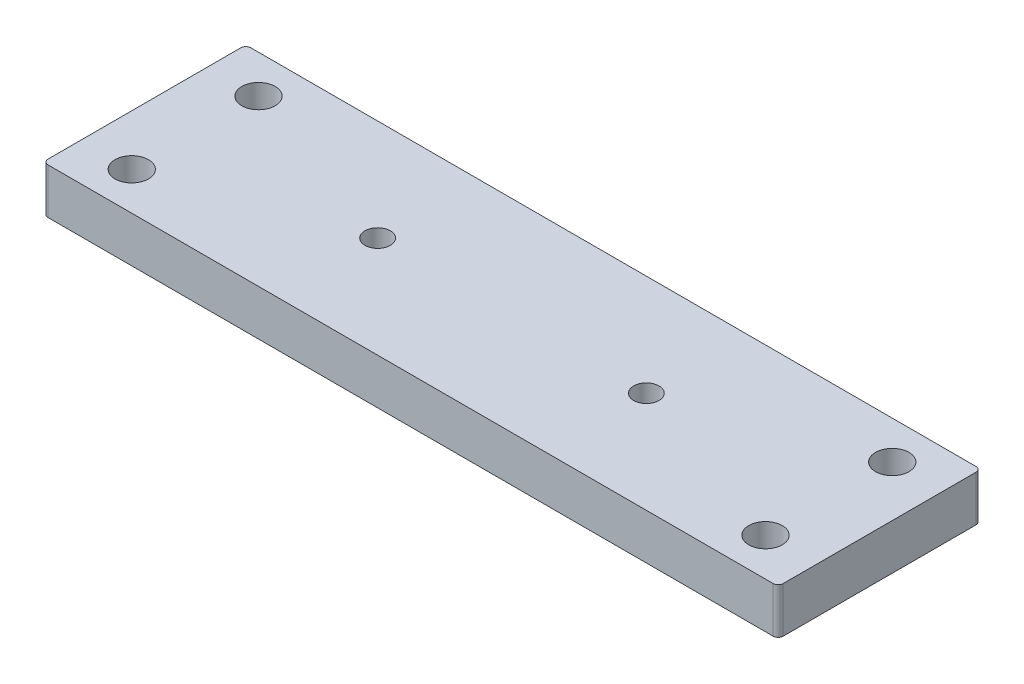
ISO-10303-21;
HEADER;
FILE_DESCRIPTION(('STEP AP214'),'2;1');
FILE_NAME('part.step','',(''),(''),'','','');
FILE_SCHEMA(('AUTOMOTIVE_DESIGN { 1 0 10303 214 1 1 1 1 }'));
ENDSEC;
DATA;
#1=APPLICATION_CONTEXT('core data for automotive mechanical design processes');
#2=APPLICATION_PROTOCOL_DEFINITION('international standard','automotive_design',2000,#1);
#3=PRODUCT_CONTEXT('',#1,'mechanical');
#4=PRODUCT('Part','Part','',(#3));
#5=PRODUCT_RELATED_PRODUCT_CATEGORY('part','',(#4));
#6=PRODUCT_DEFINITION_FORMATION('','',#4);
#7=PRODUCT_DEFINITION_CONTEXT('part definition',#1,'design');
#8=PRODUCT_DEFINITION('design','',#6,#7);
#9=PRODUCT_DEFINITION_SHAPE('','',#8);
#10=(LENGTH_UNIT() NAMED_UNIT(*) SI_UNIT(.MILLI.,.METRE.));
#11=(NAMED_UNIT(*) PLANE_ANGLE_UNIT() SI_UNIT($,.RADIAN.));
#12=(NAMED_UNIT(*) SI_UNIT($,.STERADIAN.) SOLID_ANGLE_UNIT());
#13=UNCERTAINTY_MEASURE_WITH_UNIT(LENGTH_MEASURE(1.E-05),#10,'distance_accuracy_value','');
#14=(GEOMETRIC_REPRESENTATION_CONTEXT(3) GLOBAL_UNCERTAINTY_ASSIGNED_CONTEXT((#13)) GLOBAL_UNIT_ASSIGNED_CONTEXT((#10,
#11,#12)) REPRESENTATION_CONTEXT('',''));
#15=CARTESIAN_POINT('',(0.,0.,0.));
#16=DIRECTION('',(0.,0.,1.));
#17=DIRECTION('',(1.,0.,0.));
#18=AXIS2_PLACEMENT_3D('',#15,#16,#17);
#19=CARTESIAN_POINT('',(0.,9.,0.));
#20=DIRECTION('',(0.,-1.,0.));
#21=DIRECTION('',(0.,0.,-1.));
#22=AXIS2_PLACEMENT_3D('',#19,#20,#21);
#23=PLANE('',#22);
#24=DIRECTION('',(0.,0.,-1.));
#25=VECTOR('',#24,1.);
#26=CARTESIAN_POINT('',(72.5,9.,20.));
#27=LINE('',#26,#25);
#28=CARTESIAN_POINT('',(72.5,9.,19.));
#29=VERTEX_POINT('',#28);
#30=CARTESIAN_POINT('',(72.5,9.,-19.));
#31=VERTEX_POINT('',#30);
#32=EDGE_CURVE('E151',#29,#31,#27,.T.);
#33=ORIENTED_EDGE('',*,*,#32,.T.);
#34=CARTESIAN_POINT('',(71.5,9.,-19.));
#35=DIRECTION('',(0.,-1.,0.));
#36=DIRECTION('',(0.,0.,-1.));
#37=AXIS2_PLACEMENT_3D('',#34,#35,#36);
#38=CIRCLE('',#37,1.);
#39=CARTESIAN_POINT('',(71.5,9.,-20.));
#40=VERTEX_POINT('',#39);
#41=EDGE_CURVE('E174',#31,#40,#38,.F.);
#42=ORIENTED_EDGE('',*,*,#41,.T.);
#43=DIRECTION('',(-1.,0.,0.));
#44=VECTOR('',#43,1.);
#45=CARTESIAN_POINT('',(-72.5,9.,-20.));
#46=LINE('',#45,#44);
#47=CARTESIAN_POINT('',(-71.5,9.,-20.));
#48=VERTEX_POINT('',#47);
#49=EDGE_CURVE('E127',#40,#48,#46,.T.);
#50=ORIENTED_EDGE('',*,*,#49,.T.);
#51=CARTESIAN_POINT('',(-71.5,9.,-19.));
#52=DIRECTION('',(0.,-1.,0.));
#53=DIRECTION('',(0.,0.,-1.));
#54=AXIS2_PLACEMENT_3D('',#51,#52,#53);
#55=CIRCLE('',#54,1.);
#56=CARTESIAN_POINT('',(-72.5,9.,-19.));
#57=VERTEX_POINT('',#56);
#58=EDGE_CURVE('E168',#48,#57,#55,.F.);
#59=ORIENTED_EDGE('',*,*,#58,.T.);
#60=DIRECTION('',(0.,0.,1.));
#61=VECTOR('',#60,1.);
#62=CARTESIAN_POINT('',(-72.5,9.,20.));
#63=LINE('',#62,#61);
#64=CARTESIAN_POINT('',(-72.5,9.,19.));
#65=VERTEX_POINT('',#64);
#66=EDGE_CURVE('E187',#57,#65,#63,.T.);
#67=ORIENTED_EDGE('',*,*,#66,.T.);
#68=CARTESIAN_POINT('',(-71.5,9.,19.));
#69=DIRECTION('',(0.,-1.,0.));
#70=DIRECTION('',(0.,0.,-1.));
#71=AXIS2_PLACEMENT_3D('',#68,#69,#70);
#72=CIRCLE('',#71,1.);
#73=CARTESIAN_POINT('',(-71.5,9.,20.));
#74=VERTEX_POINT('',#73);
#75=EDGE_CURVE('E61',#65,#74,#72,.F.);
#76=ORIENTED_EDGE('',*,*,#75,.T.);
#77=DIRECTION('',(1.,0.,0.));
#78=VECTOR('',#77,1.);
#79=CARTESIAN_POINT('',(-72.5,9.,20.));
#80=LINE('',#79,#78);
#81=CARTESIAN_POINT('',(71.5,9.,20.));
#82=VERTEX_POINT('',#81);
#83=EDGE_CURVE('E153',#74,#82,#80,.T.);
#84=ORIENTED_EDGE('',*,*,#83,.T.);
#85=CARTESIAN_POINT('',(71.5,9.,19.));
#86=DIRECTION('',(0.,-1.,0.));
#87=DIRECTION('',(0.,0.,-1.));
#88=AXIS2_PLACEMENT_3D('',#85,#86,#87);
#89=CIRCLE('',#88,1.);
#90=EDGE_CURVE('E171',#82,#29,#89,.F.);
#91=ORIENTED_EDGE('',*,*,#90,.T.);
#92=EDGE_LOOP('',(#33,#42,#50,#59,#67,#76,#84,#91));
#93=FACE_BOUND('',#92,.T.);
#94=CARTESIAN_POINT('',(26.5,9.,0.));
#95=DIRECTION('',(0.,1.,0.));
#96=DIRECTION('',(0.,0.,1.));
#97=AXIS2_PLACEMENT_3D('',#94,#95,#96);
#98=CIRCLE('',#97,2.5);
#99=CARTESIAN_POINT('',(26.5,9.,2.5));
#100=VERTEX_POINT('',#99);
#101=EDGE_CURVE('E145',#100,#100,#98,.T.);
#102=ORIENTED_EDGE('',*,*,#101,.F.);
#103=EDGE_LOOP('',(#102));
#104=FACE_BOUND('',#103,.T.);
#105=CARTESIAN_POINT('',(62.5,9.,12.5));
#106=DIRECTION('',(0.,1.,0.));
#107=DIRECTION('',(0.,0.,1.));
#108=AXIS2_PLACEMENT_3D('',#105,#106,#107);
#109=CIRCLE('',#108,3.30000000000001);
#110=CARTESIAN_POINT('',(62.5,9.,15.8));
#111=VERTEX_POINT('',#110);
#112=EDGE_CURVE('E215',#111,#111,#109,.T.);
#113=ORIENTED_EDGE('',*,*,#112,.F.);
#114=EDGE_LOOP('',(#113));
#115=FACE_BOUND('',#114,.T.);
#116=CARTESIAN_POINT('',(62.5,9.,-12.5));
#117=DIRECTION('',(0.,1.,0.));
#118=DIRECTION('',(0.,0.,-1.));
#119=AXIS2_PLACEMENT_3D('',#116,#117,#118);
#120=CIRCLE('',#119,3.30000000000001);
#121=CARTESIAN_POINT('',(62.5,9.,-15.8));
#122=VERTEX_POINT('',#121);
#123=EDGE_CURVE('E223',#122,#122,#120,.T.);
#124=ORIENTED_EDGE('',*,*,#123,.F.);
#125=EDGE_LOOP('',(#124));
#126=FACE_BOUND('',#125,.T.);
#127=CARTESIAN_POINT('',(-62.5,9.,12.500000000006));
#128=DIRECTION('',(0.,1.,0.));
#129=DIRECTION('',(0.,0.,1.));
#130=AXIS2_PLACEMENT_3D('',#127,#128,#129);
#131=CIRCLE('',#130,3.3);
#132=CARTESIAN_POINT('',(-62.5,9.,15.800000000006));
#133=VERTEX_POINT('',#132);
#134=EDGE_CURVE('E231',#133,#133,#131,.T.);
#135=ORIENTED_EDGE('',*,*,#134,.F.);
#136=EDGE_LOOP('',(#135));
#137=FACE_BOUND('',#136,.T.);
#138=CARTESIAN_POINT('',(-62.5,9.,-12.499999999994));
#139=DIRECTION('',(0.,1.,0.));
#140=DIRECTION('',(0.,0.,-1.));
#141=AXIS2_PLACEMENT_3D('',#138,#139,#140);
#142=CIRCLE('',#141,3.3);
#143=CARTESIAN_POINT('',(-62.5,9.,-15.799999999994));
#144=VERTEX_POINT('',#143);
#145=EDGE_CURVE('E239',#144,#144,#142,.T.);
#146=ORIENTED_EDGE('',*,*,#145,.F.);
#147=EDGE_LOOP('',(#146));
#148=FACE_BOUND('',#147,.T.);
#149=CARTESIAN_POINT('',(-26.5,9.,0.));
#150=DIRECTION('',(0.,1.,0.));
#151=DIRECTION('',(0.,0.,-1.));
#152=AXIS2_PLACEMENT_3D('',#149,#150,#151);
#153=CIRCLE('',#152,2.5);
#154=CARTESIAN_POINT('',(-26.5,9.,-2.49999999999999));
#155=VERTEX_POINT('',#154);
#156=EDGE_CURVE('E247',#155,#155,#153,.T.);
#157=ORIENTED_EDGE('',*,*,#156,.F.);
#158=EDGE_LOOP('',(#157));
#159=FACE_BOUND('',#158,.T.);
#160=ADVANCED_FACE('F38',(#93,#104,#115,#126,#137,#148,#159),#23,.F.);
#161=CARTESIAN_POINT('',(0.,0.,0.));
#162=DIRECTION('',(0.,-1.,0.));
#163=DIRECTION('',(0.,0.,-1.));
#164=AXIS2_PLACEMENT_3D('',#161,#162,#163);
#165=PLANE('',#164);
#166=CARTESIAN_POINT('',(-62.5,0.,-12.499999999994));
#167=DIRECTION('',(0.,1.,0.));
#168=DIRECTION('',(0.,0.,-1.));
#169=AXIS2_PLACEMENT_3D('',#166,#167,#168);
#170=CIRCLE('',#169,3.3);
#171=CARTESIAN_POINT('',(-62.5,0.,-15.799999999994));
#172=VERTEX_POINT('',#171);
#173=EDGE_CURVE('E243',#172,#172,#170,.T.);
#174=ORIENTED_EDGE('',*,*,#173,.T.);
#175=EDGE_LOOP('',(#174));
#176=FACE_BOUND('',#175,.T.);
#177=CARTESIAN_POINT('',(62.5,0.,-12.5));
#178=DIRECTION('',(0.,1.,0.));
#179=DIRECTION('',(0.,0.,-1.));
#180=AXIS2_PLACEMENT_3D('',#177,#178,#179);
#181=CIRCLE('',#180,3.30000000000001);
#182=CARTESIAN_POINT('',(62.5,0.,-15.8));
#183=VERTEX_POINT('',#182);
#184=EDGE_CURVE('E227',#183,#183,#181,.T.);
#185=ORIENTED_EDGE('',*,*,#184,.T.);
#186=EDGE_LOOP('',(#185));
#187=FACE_BOUND('',#186,.T.);
#188=CARTESIAN_POINT('',(26.5,0.,0.));
#189=DIRECTION('',(0.,1.,0.));
#190=DIRECTION('',(0.,0.,1.));
#191=AXIS2_PLACEMENT_3D('',#188,#189,#190);
#192=CIRCLE('',#191,2.5);
#193=CARTESIAN_POINT('',(26.5,0.,2.5));
#194=VERTEX_POINT('',#193);
#195=EDGE_CURVE('E210',#194,#194,#192,.T.);
#196=ORIENTED_EDGE('',*,*,#195,.T.);
#197=EDGE_LOOP('',(#196));
#198=FACE_BOUND('',#197,.T.);
#199=DIRECTION('',(-1.,0.,0.));
#200=VECTOR('',#199,1.);
#201=CARTESIAN_POINT('',(-72.5,0.,-20.));
#202=LINE('',#201,#200);
#203=CARTESIAN_POINT('',(71.5,0.,-20.));
#204=VERTEX_POINT('',#203);
#205=CARTESIAN_POINT('',(-71.5,0.,-20.));
#206=VERTEX_POINT('',#205);
#207=EDGE_CURVE('E124',#204,#206,#202,.T.);
#208=ORIENTED_EDGE('',*,*,#207,.F.);
#209=CARTESIAN_POINT('',(71.5,0.,-19.));
#210=DIRECTION('',(0.,-1.,0.));
#211=DIRECTION('',(0.,0.,-1.));
#212=AXIS2_PLACEMENT_3D('',#209,#210,#211);
#213=CIRCLE('',#212,1.);
#214=CARTESIAN_POINT('',(72.5,0.,-19.));
#215=VERTEX_POINT('',#214);
#216=EDGE_CURVE('E106',#204,#215,#213,.T.);
#217=ORIENTED_EDGE('',*,*,#216,.T.);
#218=DIRECTION('',(0.,0.,-1.));
#219=VECTOR('',#218,1.);
#220=CARTESIAN_POINT('',(72.5,0.,20.));
#221=LINE('',#220,#219);
#222=CARTESIAN_POINT('',(72.5,0.,19.));
#223=VERTEX_POINT('',#222);
#224=EDGE_CURVE('E138',#223,#215,#221,.T.);
#225=ORIENTED_EDGE('',*,*,#224,.F.);
#226=CARTESIAN_POINT('',(71.5,0.,19.));
#227=DIRECTION('',(0.,-1.,0.));
#228=DIRECTION('',(0.,0.,-1.));
#229=AXIS2_PLACEMENT_3D('',#226,#227,#228);
#230=CIRCLE('',#229,1.);
#231=CARTESIAN_POINT('',(71.5,0.,20.));
#232=VERTEX_POINT('',#231);
#233=EDGE_CURVE('E118',#223,#232,#230,.T.);
#234=ORIENTED_EDGE('',*,*,#233,.T.);
#235=DIRECTION('',(1.,0.,0.));
#236=VECTOR('',#235,1.);
#237=CARTESIAN_POINT('',(-72.5,0.,20.));
#238=LINE('',#237,#236);
#239=CARTESIAN_POINT('',(-71.5,0.,20.));
#240=VERTEX_POINT('',#239);
#241=EDGE_CURVE('E143',#240,#232,#238,.T.);
#242=ORIENTED_EDGE('',*,*,#241,.F.);
#243=CARTESIAN_POINT('',(-71.5,0.,19.));
#244=DIRECTION('',(0.,-1.,0.));
#245=DIRECTION('',(0.,0.,-1.));
#246=AXIS2_PLACEMENT_3D('',#243,#244,#245);
#247=CIRCLE('',#246,1.);
#248=CARTESIAN_POINT('',(-72.5,0.,19.));
#249=VERTEX_POINT('',#248);
#250=EDGE_CURVE('E129',#240,#249,#247,.T.);
#251=ORIENTED_EDGE('',*,*,#250,.T.);
#252=DIRECTION('',(0.,0.,1.));
#253=VECTOR('',#252,1.);
#254=CARTESIAN_POINT('',(-72.5,0.,20.));
#255=LINE('',#254,#253);
#256=CARTESIAN_POINT('',(-72.5,0.,-19.));
#257=VERTEX_POINT('',#256);
#258=EDGE_CURVE('E137',#257,#249,#255,.T.);
#259=ORIENTED_EDGE('',*,*,#258,.F.);
#260=CARTESIAN_POINT('',(-71.5,0.,-19.));
#261=DIRECTION('',(0.,-1.,0.));
#262=DIRECTION('',(0.,0.,-1.));
#263=AXIS2_PLACEMENT_3D('',#260,#261,#262);
#264=CIRCLE('',#263,1.);
#265=EDGE_CURVE('E135',#257,#206,#264,.T.);
#266=ORIENTED_EDGE('',*,*,#265,.T.);
#267=EDGE_LOOP('',(#208,#217,#225,#234,#242,#251,#259,#266));
#268=FACE_BOUND('',#267,.T.);
#269=CARTESIAN_POINT('',(62.5,0.,12.5));
#270=DIRECTION('',(0.,1.,0.));
#271=DIRECTION('',(0.,0.,1.));
#272=AXIS2_PLACEMENT_3D('',#269,#270,#271);
#273=CIRCLE('',#272,3.30000000000001);
#274=CARTESIAN_POINT('',(62.5,0.,15.8));
#275=VERTEX_POINT('',#274);
#276=EDGE_CURVE('E219',#275,#275,#273,.T.);
#277=ORIENTED_EDGE('',*,*,#276,.T.);
#278=EDGE_LOOP('',(#277));
#279=FACE_BOUND('',#278,.T.);
#280=CARTESIAN_POINT('',(-62.5,0.,12.500000000006));
#281=DIRECTION('',(0.,1.,0.));
#282=DIRECTION('',(0.,0.,1.));
#283=AXIS2_PLACEMENT_3D('',#280,#281,#282);
#284=CIRCLE('',#283,3.3);
#285=CARTESIAN_POINT('',(-62.5,0.,15.800000000006));
#286=VERTEX_POINT('',#285);
#287=EDGE_CURVE('E235',#286,#286,#284,.T.);
#288=ORIENTED_EDGE('',*,*,#287,.T.);
#289=EDGE_LOOP('',(#288));
#290=FACE_BOUND('',#289,.T.);
#291=CARTESIAN_POINT('',(-26.5,0.,0.));
#292=DIRECTION('',(0.,1.,0.));
#293=DIRECTION('',(0.,0.,-1.));
#294=AXIS2_PLACEMENT_3D('',#291,#292,#293);
#295=CIRCLE('',#294,2.5);
#296=CARTESIAN_POINT('',(-26.5,0.,-2.49999999999999));
#297=VERTEX_POINT('',#296);
#298=EDGE_CURVE('E251',#297,#297,#295,.T.);
#299=ORIENTED_EDGE('',*,*,#298,.T.);
#300=EDGE_LOOP('',(#299));
#301=FACE_BOUND('',#300,.T.);
#302=ADVANCED_FACE('F132',(#176,#187,#198,#268,#279,#290,#301),#165,.T.);
#303=CARTESIAN_POINT('',(72.5,9.,20.));
#304=DIRECTION('',(-1.,0.,0.));
#305=DIRECTION('',(0.,0.,1.));
#306=AXIS2_PLACEMENT_3D('',#303,#304,#305);
#307=PLANE('',#306);
#308=ORIENTED_EDGE('',*,*,#224,.T.);
#309=DIRECTION('',(0.,-1.,0.));
#310=VECTOR('',#309,1.);
#311=CARTESIAN_POINT('',(72.5,9.,-19.));
#312=LINE('',#311,#310);
#313=EDGE_CURVE('E111',#215,#31,#312,.F.);
#314=ORIENTED_EDGE('',*,*,#313,.T.);
#315=ORIENTED_EDGE('',*,*,#32,.F.);
#316=DIRECTION('',(0.,-1.,0.));
#317=VECTOR('',#316,1.);
#318=CARTESIAN_POINT('',(72.5,9.,19.));
#319=LINE('',#318,#317);
#320=EDGE_CURVE('E117',#29,#223,#319,.T.);
#321=ORIENTED_EDGE('',*,*,#320,.T.);
#322=EDGE_LOOP('',(#308,#314,#315,#321));
#323=FACE_BOUND('',#322,.T.);
#324=ADVANCED_FACE('F204',(#323),#307,.F.);
#325=CARTESIAN_POINT('',(-72.5,9.,-20.));
#326=DIRECTION('',(0.,0.,1.));
#327=DIRECTION('',(1.,0.,0.));
#328=AXIS2_PLACEMENT_3D('',#325,#326,#327);
#329=PLANE('',#328);
#330=ORIENTED_EDGE('',*,*,#49,.F.);
#331=DIRECTION('',(0.,-1.,0.));
#332=VECTOR('',#331,1.);
#333=CARTESIAN_POINT('',(71.5,9.,-20.));
#334=LINE('',#333,#332);
#335=EDGE_CURVE('E110',#40,#204,#334,.T.);
#336=ORIENTED_EDGE('',*,*,#335,.T.);
#337=ORIENTED_EDGE('',*,*,#207,.T.);
#338=DIRECTION('',(0.,-1.,0.));
#339=VECTOR('',#338,1.);
#340=CARTESIAN_POINT('',(-71.5,9.,-20.));
#341=LINE('',#340,#339);
#342=EDGE_CURVE('E130',#206,#48,#341,.F.);
#343=ORIENTED_EDGE('',*,*,#342,.T.);
#344=EDGE_LOOP('',(#330,#336,#337,#343));
#345=FACE_BOUND('',#344,.T.);
#346=ADVANCED_FACE('F123',(#345),#329,.F.);
#347=CARTESIAN_POINT('',(-72.5,9.,20.));
#348=DIRECTION('',(1.,0.,0.));
#349=DIRECTION('',(0.,0.,-1.));
#350=AXIS2_PLACEMENT_3D('',#347,#348,#349);
#351=PLANE('',#350);
#352=ORIENTED_EDGE('',*,*,#66,.F.);
#353=DIRECTION('',(0.,-1.,0.));
#354=VECTOR('',#353,1.);
#355=CARTESIAN_POINT('',(-72.5,9.,-19.));
#356=LINE('',#355,#354);
#357=EDGE_CURVE('E11',#57,#257,#356,.T.);
#358=ORIENTED_EDGE('',*,*,#357,.T.);
#359=ORIENTED_EDGE('',*,*,#258,.T.);
#360=DIRECTION('',(0.,-1.,0.));
#361=VECTOR('',#360,1.);
#362=CARTESIAN_POINT('',(-72.5,9.,19.));
#363=LINE('',#362,#361);
#364=EDGE_CURVE('E47',#249,#65,#363,.F.);
#365=ORIENTED_EDGE('',*,*,#364,.T.);
#366=EDGE_LOOP('',(#352,#358,#359,#365));
#367=FACE_BOUND('',#366,.T.);
#368=ADVANCED_FACE('F186',(#367),#351,.F.);
#369=CARTESIAN_POINT('',(-72.5,9.,20.));
#370=DIRECTION('',(0.,0.,-1.));
#371=DIRECTION('',(-1.,0.,0.));
#372=AXIS2_PLACEMENT_3D('',#369,#370,#371);
#373=PLANE('',#372);
#374=ORIENTED_EDGE('',*,*,#241,.T.);
#375=DIRECTION('',(0.,-1.,0.));
#376=VECTOR('',#375,1.);
#377=CARTESIAN_POINT('',(71.5,9.,20.));
#378=LINE('',#377,#376);
#379=EDGE_CURVE('E54',#232,#82,#378,.F.);
#380=ORIENTED_EDGE('',*,*,#379,.T.);
#381=ORIENTED_EDGE('',*,*,#83,.F.);
#382=DIRECTION('',(0.,-1.,0.));
#383=VECTOR('',#382,1.);
#384=CARTESIAN_POINT('',(-71.5,9.,20.));
#385=LINE('',#384,#383);
#386=EDGE_CURVE('E177',#74,#240,#385,.T.);
#387=ORIENTED_EDGE('',*,*,#386,.T.);
#388=EDGE_LOOP('',(#374,#380,#381,#387));
#389=FACE_BOUND('',#388,.T.);
#390=ADVANCED_FACE('F197',(#389),#373,.F.);
#391=CARTESIAN_POINT('',(26.5,9.,0.));
#392=DIRECTION('',(0.,-1.,0.));
#393=DIRECTION('',(0.,0.,-1.));
#394=AXIS2_PLACEMENT_3D('',#391,#392,#393);
#395=CYLINDRICAL_SURFACE('',#394,2.5);
#396=ORIENTED_EDGE('',*,*,#101,.T.);
#397=EDGE_LOOP('',(#396));
#398=FACE_BOUND('',#397,.T.);
#399=ORIENTED_EDGE('',*,*,#195,.F.);
#400=EDGE_LOOP('',(#399));
#401=FACE_BOUND('',#400,.T.);
#402=ADVANCED_FACE('F270',(#398,#401),#395,.F.);
#403=CARTESIAN_POINT('',(62.5,9.,12.5));
#404=DIRECTION('',(0.,-1.,0.));
#405=DIRECTION('',(0.,0.,-1.));
#406=AXIS2_PLACEMENT_3D('',#403,#404,#405);
#407=CYLINDRICAL_SURFACE('',#406,3.30000000000001);
#408=ORIENTED_EDGE('',*,*,#112,.T.);
#409=EDGE_LOOP('',(#408));
#410=FACE_BOUND('',#409,.T.);
#411=ORIENTED_EDGE('',*,*,#276,.F.);
#412=EDGE_LOOP('',(#411));
#413=FACE_BOUND('',#412,.T.);
#414=ADVANCED_FACE('F382',(#410,#413),#407,.F.);
#415=CARTESIAN_POINT('',(62.5,9.,-12.5));
#416=DIRECTION('',(0.,-1.,0.));
#417=DIRECTION('',(0.,0.,-1.));
#418=AXIS2_PLACEMENT_3D('',#415,#416,#417);
#419=CYLINDRICAL_SURFACE('',#418,3.30000000000001);
#420=ORIENTED_EDGE('',*,*,#123,.T.);
#421=EDGE_LOOP('',(#420));
#422=FACE_BOUND('',#421,.T.);
#423=ORIENTED_EDGE('',*,*,#184,.F.);
#424=EDGE_LOOP('',(#423));
#425=FACE_BOUND('',#424,.T.);
#426=ADVANCED_FACE('F372',(#422,#425),#419,.F.);
#427=CARTESIAN_POINT('',(-62.5,9.,12.500000000006));
#428=DIRECTION('',(0.,-1.,0.));
#429=DIRECTION('',(0.,0.,-1.));
#430=AXIS2_PLACEMENT_3D('',#427,#428,#429);
#431=CYLINDRICAL_SURFACE('',#430,3.3);
#432=ORIENTED_EDGE('',*,*,#134,.T.);
#433=EDGE_LOOP('',(#432));
#434=FACE_BOUND('',#433,.T.);
#435=ORIENTED_EDGE('',*,*,#287,.F.);
#436=EDGE_LOOP('',(#435));
#437=FACE_BOUND('',#436,.T.);
#438=ADVANCED_FACE('F362',(#434,#437),#431,.F.);
#439=CARTESIAN_POINT('',(-62.5,9.,-12.499999999994));
#440=DIRECTION('',(0.,-1.,0.));
#441=DIRECTION('',(0.,0.,-1.));
#442=AXIS2_PLACEMENT_3D('',#439,#440,#441);
#443=CYLINDRICAL_SURFACE('',#442,3.3);
#444=ORIENTED_EDGE('',*,*,#145,.T.);
#445=EDGE_LOOP('',(#444));
#446=FACE_BOUND('',#445,.T.);
#447=ORIENTED_EDGE('',*,*,#173,.F.);
#448=EDGE_LOOP('',(#447));
#449=FACE_BOUND('',#448,.T.);
#450=ADVANCED_FACE('F353',(#446,#449),#443,.F.);
#451=CARTESIAN_POINT('',(-26.5,9.,0.));
#452=DIRECTION('',(0.,-1.,0.));
#453=DIRECTION('',(0.,0.,-1.));
#454=AXIS2_PLACEMENT_3D('',#451,#452,#453);
#455=CYLINDRICAL_SURFACE('',#454,2.5);
#456=ORIENTED_EDGE('',*,*,#156,.T.);
#457=EDGE_LOOP('',(#456));
#458=FACE_BOUND('',#457,.T.);
#459=ORIENTED_EDGE('',*,*,#298,.F.);
#460=EDGE_LOOP('',(#459));
#461=FACE_BOUND('',#460,.T.);
#462=ADVANCED_FACE('F259',(#458,#461),#455,.F.);
#463=CARTESIAN_POINT('',(71.5,9.,-19.));
#464=DIRECTION('',(0.,-1.,0.));
#465=DIRECTION('',(0.,0.,-1.));
#466=AXIS2_PLACEMENT_3D('',#463,#464,#465);
#467=CYLINDRICAL_SURFACE('',#466,1.);
#468=ORIENTED_EDGE('',*,*,#41,.F.);
#469=ORIENTED_EDGE('',*,*,#313,.F.);
#470=ORIENTED_EDGE('',*,*,#216,.F.);
#471=ORIENTED_EDGE('',*,*,#335,.F.);
#472=EDGE_LOOP('',(#468,#469,#470,#471));
#473=FACE_BOUND('',#472,.T.);
#474=ADVANCED_FACE('F109',(#473),#467,.T.);
#475=CARTESIAN_POINT('',(71.5,9.,19.));
#476=DIRECTION('',(0.,-1.,0.));
#477=DIRECTION('',(0.,0.,-1.));
#478=AXIS2_PLACEMENT_3D('',#475,#476,#477);
#479=CYLINDRICAL_SURFACE('',#478,1.);
#480=ORIENTED_EDGE('',*,*,#90,.F.);
#481=ORIENTED_EDGE('',*,*,#379,.F.);
#482=ORIENTED_EDGE('',*,*,#233,.F.);
#483=ORIENTED_EDGE('',*,*,#320,.F.);
#484=EDGE_LOOP('',(#480,#481,#482,#483));
#485=FACE_BOUND('',#484,.T.);
#486=ADVANCED_FACE('F201',(#485),#479,.T.);
#487=CARTESIAN_POINT('',(-71.5,9.,-19.));
#488=DIRECTION('',(0.,-1.,0.));
#489=DIRECTION('',(0.,0.,-1.));
#490=AXIS2_PLACEMENT_3D('',#487,#488,#489);
#491=CYLINDRICAL_SURFACE('',#490,1.);
#492=ORIENTED_EDGE('',*,*,#58,.F.);
#493=ORIENTED_EDGE('',*,*,#342,.F.);
#494=ORIENTED_EDGE('',*,*,#265,.F.);
#495=ORIENTED_EDGE('',*,*,#357,.F.);
#496=EDGE_LOOP('',(#492,#493,#494,#495));
#497=FACE_BOUND('',#496,.T.);
#498=ADVANCED_FACE('F284',(#497),#491,.T.);
#499=CARTESIAN_POINT('',(-71.5,9.,19.));
#500=DIRECTION('',(0.,-1.,0.));
#501=DIRECTION('',(0.,0.,-1.));
#502=AXIS2_PLACEMENT_3D('',#499,#500,#501);
#503=CYLINDRICAL_SURFACE('',#502,1.);
#504=ORIENTED_EDGE('',*,*,#75,.F.);
#505=ORIENTED_EDGE('',*,*,#364,.F.);
#506=ORIENTED_EDGE('',*,*,#250,.F.);
#507=ORIENTED_EDGE('',*,*,#386,.F.);
#508=EDGE_LOOP('',(#504,#505,#506,#507));
#509=FACE_BOUND('',#508,.T.);
#510=ADVANCED_FACE('F40',(#509),#503,.T.);
#511=CLOSED_SHELL('',(#160,#302,#324,#346,#368,#390,#402,#414,#426,#438,#450,#462,#474,#486,
#498,#510));
#512=MANIFOLD_SOLID_BREP('B2',#511);
#513=ADVANCED_BREP_SHAPE_REPRESENTATION('',(#18,#512),#14);
#514=SHAPE_DEFINITION_REPRESENTATION(#9,#513);
ENDSEC;
END-ISO-10303-21;
